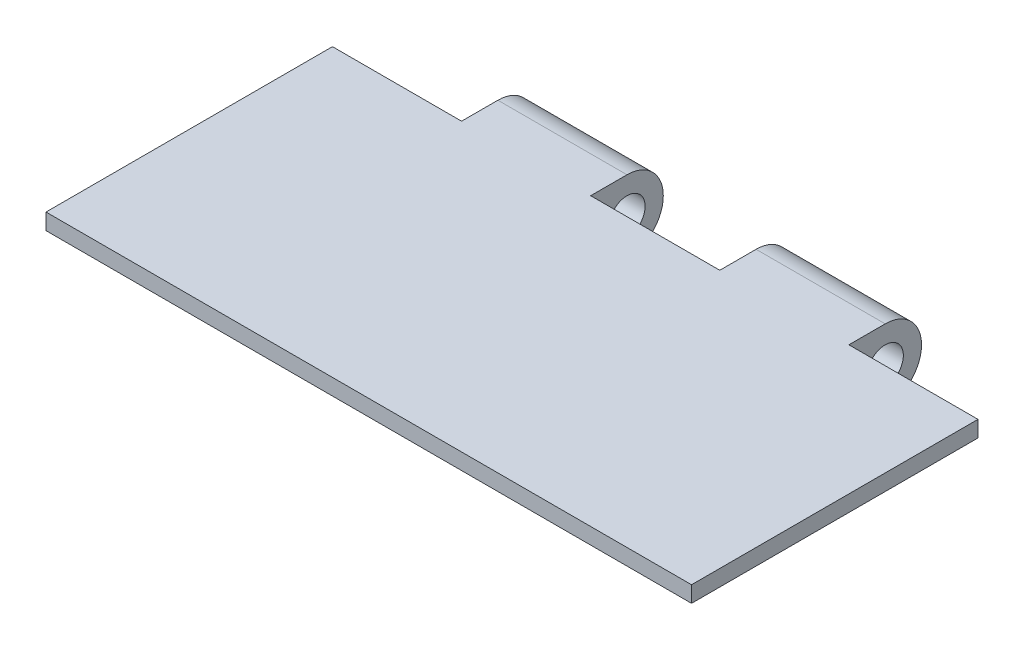
ISO-10303-21;
HEADER;
FILE_DESCRIPTION(('STEP AP214'),'2;1');
FILE_NAME('part.step','',(''),(''),'','','');
FILE_SCHEMA(('AUTOMOTIVE_DESIGN { 1 0 10303 214 1 1 1 1 }'));
ENDSEC;
DATA;
#1=APPLICATION_CONTEXT('core data for automotive mechanical design processes');
#2=APPLICATION_PROTOCOL_DEFINITION('international standard','automotive_design',2000,#1);
#3=PRODUCT_CONTEXT('',#1,'mechanical');
#4=PRODUCT('Part','Part','',(#3));
#5=PRODUCT_RELATED_PRODUCT_CATEGORY('part','',(#4));
#6=PRODUCT_DEFINITION_FORMATION('','',#4);
#7=PRODUCT_DEFINITION_CONTEXT('part definition',#1,'design');
#8=PRODUCT_DEFINITION('design','',#6,#7);
#9=PRODUCT_DEFINITION_SHAPE('','',#8);
#10=(LENGTH_UNIT() NAMED_UNIT(*) SI_UNIT(.MILLI.,.METRE.));
#11=(NAMED_UNIT(*) PLANE_ANGLE_UNIT() SI_UNIT($,.RADIAN.));
#12=(NAMED_UNIT(*) SI_UNIT($,.STERADIAN.) SOLID_ANGLE_UNIT());
#13=UNCERTAINTY_MEASURE_WITH_UNIT(LENGTH_MEASURE(1.E-05),#10,'distance_accuracy_value','');
#14=(GEOMETRIC_REPRESENTATION_CONTEXT(3) GLOBAL_UNCERTAINTY_ASSIGNED_CONTEXT((#13)) GLOBAL_UNIT_ASSIGNED_CONTEXT((#10,
#11,#12)) REPRESENTATION_CONTEXT('',''));
#15=CARTESIAN_POINT('',(0.,0.,0.));
#16=DIRECTION('',(0.,0.,1.));
#17=DIRECTION('',(1.,0.,0.));
#18=AXIS2_PLACEMENT_3D('',#15,#16,#17);
#19=CARTESIAN_POINT('',(2.68913183279742,0.635,-10.5257360713697));
#20=DIRECTION('',(1.,0.,0.));
#21=DIRECTION('',(0.,0.,-1.));
#22=AXIS2_PLACEMENT_3D('',#19,#20,#21);
#23=PLANE('',#22);
#24=DIRECTION('',(0.,0.,1.));
#25=VECTOR('',#24,1.);
#26=CARTESIAN_POINT('',(2.68913183279742,0.,-10.5257360713697));
#27=LINE('',#26,#25);
#28=CARTESIAN_POINT('',(2.68913183279742,0.,-10.5257360713697));
#29=VERTEX_POINT('',#28);
#30=CARTESIAN_POINT('',(2.68913183279743,0.,0.74551392863026));
#31=VERTEX_POINT('',#30);
#32=EDGE_CURVE('E276',#29,#31,#27,.T.);
#33=ORIENTED_EDGE('',*,*,#32,.T.);
#34=DIRECTION('',(0.,-1.,0.));
#35=VECTOR('',#34,1.);
#36=CARTESIAN_POINT('',(2.68913183279743,0.635,0.74551392863026));
#37=LINE('',#36,#35);
#38=CARTESIAN_POINT('',(2.68913183279743,0.635,0.74551392863026));
#39=VERTEX_POINT('',#38);
#40=EDGE_CURVE('E206',#39,#31,#37,.T.);
#41=ORIENTED_EDGE('',*,*,#40,.F.);
#42=DIRECTION('',(0.,0.,1.));
#43=VECTOR('',#42,1.);
#44=CARTESIAN_POINT('',(2.68913183279742,0.635,-10.5257360713697));
#45=LINE('',#44,#43);
#46=CARTESIAN_POINT('',(2.68913183279742,0.635,-10.5257360713697));
#47=VERTEX_POINT('',#46);
#48=EDGE_CURVE('E286',#47,#39,#45,.T.);
#49=ORIENTED_EDGE('',*,*,#48,.F.);
#50=DIRECTION('',(0.,-1.,0.));
#51=VECTOR('',#50,1.);
#52=CARTESIAN_POINT('',(2.68913183279742,0.635,-10.5257360713697));
#53=LINE('',#52,#51);
#54=EDGE_CURVE('E275',#47,#29,#53,.T.);
#55=ORIENTED_EDGE('',*,*,#54,.T.);
#56=EDGE_LOOP('',(#33,#41,#49,#55));
#57=FACE_BOUND('',#56,.T.);
#58=ADVANCED_FACE('F48',(#57),#23,.F.);
#59=CARTESIAN_POINT('',(28.0891318327974,0.635,0.745513928630257));
#60=DIRECTION('',(0.,0.,-1.));
#61=DIRECTION('',(-1.,0.,0.));
#62=AXIS2_PLACEMENT_3D('',#59,#60,#61);
#63=PLANE('',#62);
#64=DIRECTION('',(1.,0.,0.));
#65=VECTOR('',#64,1.);
#66=CARTESIAN_POINT('',(28.0891318327974,0.,0.745513928630257));
#67=LINE('',#66,#65);
#68=CARTESIAN_POINT('',(28.0891318327974,0.,0.745513928630257));
#69=VERTEX_POINT('',#68);
#70=EDGE_CURVE('E279',#31,#69,#67,.T.);
#71=ORIENTED_EDGE('',*,*,#70,.T.);
#72=DIRECTION('',(0.,-1.,0.));
#73=VECTOR('',#72,1.);
#74=CARTESIAN_POINT('',(28.0891318327974,0.635,0.745513928630257));
#75=LINE('',#74,#73);
#76=CARTESIAN_POINT('',(28.0891318327974,0.635,0.745513928630257));
#77=VERTEX_POINT('',#76);
#78=EDGE_CURVE('E297',#77,#69,#75,.T.);
#79=ORIENTED_EDGE('',*,*,#78,.F.);
#80=DIRECTION('',(1.,0.,0.));
#81=VECTOR('',#80,1.);
#82=CARTESIAN_POINT('',(28.0891318327974,0.635,0.745513928630257));
#83=LINE('',#82,#81);
#84=EDGE_CURVE('E304',#39,#77,#83,.T.);
#85=ORIENTED_EDGE('',*,*,#84,.F.);
#86=ORIENTED_EDGE('',*,*,#40,.T.);
#87=EDGE_LOOP('',(#71,#79,#85,#86));
#88=FACE_BOUND('',#87,.T.);
#89=ADVANCED_FACE('F302',(#88),#63,.F.);
#90=CARTESIAN_POINT('',(28.0891318327974,0.635,-10.5257360713697));
#91=DIRECTION('',(-1.,0.,0.));
#92=DIRECTION('',(0.,0.,1.));
#93=AXIS2_PLACEMENT_3D('',#90,#91,#92);
#94=PLANE('',#93);
#95=DIRECTION('',(0.,0.,-1.));
#96=VECTOR('',#95,1.);
#97=CARTESIAN_POINT('',(28.0891318327974,0.,-10.5257360713697));
#98=LINE('',#97,#96);
#99=CARTESIAN_POINT('',(28.0891318327974,0.,-10.5257360713697));
#100=VERTEX_POINT('',#99);
#101=EDGE_CURVE('E282',#69,#100,#98,.T.);
#102=ORIENTED_EDGE('',*,*,#101,.T.);
#103=DIRECTION('',(0.,-1.,0.));
#104=VECTOR('',#103,1.);
#105=CARTESIAN_POINT('',(28.0891318327974,0.635,-10.5257360713697));
#106=LINE('',#105,#104);
#107=CARTESIAN_POINT('',(28.0891318327974,0.635,-10.5257360713697));
#108=VERTEX_POINT('',#107);
#109=EDGE_CURVE('E294',#108,#100,#106,.T.);
#110=ORIENTED_EDGE('',*,*,#109,.F.);
#111=DIRECTION('',(0.,0.,-1.));
#112=VECTOR('',#111,1.);
#113=CARTESIAN_POINT('',(28.0891318327974,0.635,-10.5257360713697));
#114=LINE('',#113,#112);
#115=EDGE_CURVE('E264',#77,#108,#114,.T.);
#116=ORIENTED_EDGE('',*,*,#115,.F.);
#117=ORIENTED_EDGE('',*,*,#78,.T.);
#118=EDGE_LOOP('',(#102,#110,#116,#117));
#119=FACE_BOUND('',#118,.T.);
#120=ADVANCED_FACE('F313',(#119),#94,.F.);
#121=CARTESIAN_POINT('',(28.0891318327974,0.635,-10.5257360713697));
#122=DIRECTION('',(0.,0.,1.));
#123=DIRECTION('',(1.,0.,0.));
#124=AXIS2_PLACEMENT_3D('',#121,#122,#123);
#125=PLANE('',#124);
#126=DIRECTION('',(-1.,0.,0.));
#127=VECTOR('',#126,1.);
#128=CARTESIAN_POINT('',(28.0891318327974,0.,-10.5257360713697));
#129=LINE('',#128,#127);
#130=CARTESIAN_POINT('',(23.0091318327974,0.,-10.5257360713697));
#131=VERTEX_POINT('',#130);
#132=EDGE_CURVE('E192',#100,#131,#129,.T.);
#133=ORIENTED_EDGE('',*,*,#132,.T.);
#134=DIRECTION('',(0.,-1.,0.));
#135=VECTOR('',#134,1.);
#136=CARTESIAN_POINT('',(23.0091318327974,0.635,-10.5257360713697));
#137=LINE('',#136,#135);
#138=CARTESIAN_POINT('',(23.0091318327974,0.635,-10.5257360713697));
#139=VERTEX_POINT('',#138);
#140=EDGE_CURVE('E196',#139,#131,#137,.T.);
#141=ORIENTED_EDGE('',*,*,#140,.F.);
#142=DIRECTION('',(-1.,0.,0.));
#143=VECTOR('',#142,1.);
#144=CARTESIAN_POINT('',(28.0891318327974,0.635,-10.5257360713697));
#145=LINE('',#144,#143);
#146=EDGE_CURVE('E259',#108,#139,#145,.T.);
#147=ORIENTED_EDGE('',*,*,#146,.F.);
#148=ORIENTED_EDGE('',*,*,#109,.T.);
#149=EDGE_LOOP('',(#133,#141,#147,#148));
#150=FACE_BOUND('',#149,.T.);
#151=ADVANCED_FACE('F316',(#150),#125,.F.);
#152=CARTESIAN_POINT('',(23.0091318327974,0.635,-13.3832360713697));
#153=DIRECTION('',(-1.,0.,0.));
#154=DIRECTION('',(0.,0.,1.));
#155=AXIS2_PLACEMENT_3D('',#152,#153,#154);
#156=PLANE('',#155);
#157=CARTESIAN_POINT('',(23.0091318327974,-0.79375,-11.9544860713697));
#158=DIRECTION('',(1.,0.,0.));
#159=DIRECTION('',(0.,0.,-1.));
#160=AXIS2_PLACEMENT_3D('',#157,#158,#159);
#161=CIRCLE('',#160,0.714374999999999);
#162=CARTESIAN_POINT('',(23.0091318327974,-0.79375,-12.6688610713697));
#163=VERTEX_POINT('',#162);
#164=EDGE_CURVE('E408',#163,#163,#161,.T.);
#165=ORIENTED_EDGE('',*,*,#164,.F.);
#166=EDGE_LOOP('',(#165));
#167=FACE_BOUND('',#166,.T.);
#168=DIRECTION('',(0.,1.,0.));
#169=VECTOR('',#168,1.);
#170=CARTESIAN_POINT('',(23.0091318327974,-2.2225,-10.5257360713697));
#171=LINE('',#170,#169);
#172=CARTESIAN_POINT('',(23.0091318327974,-0.79375,-10.5257360713697));
#173=VERTEX_POINT('',#172);
#174=EDGE_CURVE('E173',#173,#131,#171,.T.);
#175=ORIENTED_EDGE('',*,*,#174,.F.);
#176=CARTESIAN_POINT('',(23.0091318327974,-0.79375,-11.9544860713697));
#177=DIRECTION('',(-1.,0.,0.));
#178=DIRECTION('',(0.,0.,1.));
#179=AXIS2_PLACEMENT_3D('',#176,#177,#178);
#180=CIRCLE('',#179,1.42875);
#181=CARTESIAN_POINT('',(23.0091318327974,-2.2225,-11.9544860713697));
#182=VERTEX_POINT('',#181);
#183=EDGE_CURVE('E227',#173,#182,#180,.F.);
#184=ORIENTED_EDGE('',*,*,#183,.T.);
#185=CARTESIAN_POINT('',(23.0091318327974,-0.79375,-11.9544860713697));
#186=DIRECTION('',(-1.,0.,0.));
#187=DIRECTION('',(0.,0.,1.));
#188=AXIS2_PLACEMENT_3D('',#185,#186,#187);
#189=CIRCLE('',#188,1.42875);
#190=CARTESIAN_POINT('',(23.0091318327974,-0.79375,-13.3832360713697));
#191=VERTEX_POINT('',#190);
#192=EDGE_CURVE('E225',#182,#191,#189,.F.);
#193=ORIENTED_EDGE('',*,*,#192,.T.);
#194=CARTESIAN_POINT('',(23.0091318327974,-0.79375,-11.9544860713697));
#195=DIRECTION('',(-1.,0.,0.));
#196=DIRECTION('',(0.,0.,1.));
#197=AXIS2_PLACEMENT_3D('',#194,#195,#196);
#198=CIRCLE('',#197,1.42875);
#199=CARTESIAN_POINT('',(23.0091318327974,0.635,-11.9544860713697));
#200=VERTEX_POINT('',#199);
#201=EDGE_CURVE('E223',#191,#200,#198,.F.);
#202=ORIENTED_EDGE('',*,*,#201,.T.);
#203=DIRECTION('',(0.,0.,-1.));
#204=VECTOR('',#203,1.);
#205=CARTESIAN_POINT('',(23.0091318327974,0.635,-13.3832360713697));
#206=LINE('',#205,#204);
#207=EDGE_CURVE('E255',#139,#200,#206,.T.);
#208=ORIENTED_EDGE('',*,*,#207,.F.);
#209=ORIENTED_EDGE('',*,*,#140,.T.);
#210=EDGE_LOOP('',(#175,#184,#193,#202,#208,#209));
#211=FACE_BOUND('',#210,.T.);
#212=ADVANCED_FACE('F253',(#167,#211),#156,.F.);
#213=CARTESIAN_POINT('',(17.9291318327974,0.635,-13.3832360713697));
#214=DIRECTION('',(1.,0.,0.));
#215=DIRECTION('',(0.,0.,-1.));
#216=AXIS2_PLACEMENT_3D('',#213,#214,#215);
#217=PLANE('',#216);
#218=CARTESIAN_POINT('',(17.9291318327974,-0.79375,-11.9544860713697));
#219=DIRECTION('',(1.,0.,0.));
#220=DIRECTION('',(0.,0.,-1.));
#221=AXIS2_PLACEMENT_3D('',#218,#219,#220);
#222=CIRCLE('',#221,0.714374999999999);
#223=CARTESIAN_POINT('',(17.9291318327974,-0.79375,-12.6688610713697));
#224=VERTEX_POINT('',#223);
#225=EDGE_CURVE('E242',#224,#224,#222,.T.);
#226=ORIENTED_EDGE('',*,*,#225,.T.);
#227=EDGE_LOOP('',(#226));
#228=FACE_BOUND('',#227,.T.);
#229=CARTESIAN_POINT('',(17.9291318327974,-0.79375,-11.9544860713697));
#230=DIRECTION('',(1.,0.,0.));
#231=DIRECTION('',(0.,0.,-1.));
#232=AXIS2_PLACEMENT_3D('',#229,#230,#231);
#233=CIRCLE('',#232,1.42875);
#234=CARTESIAN_POINT('',(17.9291318327974,-0.79375,-13.3832360713697));
#235=VERTEX_POINT('',#234);
#236=CARTESIAN_POINT('',(17.9291318327974,-2.2225,-11.9544860713697));
#237=VERTEX_POINT('',#236);
#238=EDGE_CURVE('E72',#235,#237,#233,.F.);
#239=ORIENTED_EDGE('',*,*,#238,.T.);
#240=CARTESIAN_POINT('',(17.9291318327974,-0.79375,-11.9544860713697));
#241=DIRECTION('',(1.,0.,0.));
#242=DIRECTION('',(0.,0.,-1.));
#243=AXIS2_PLACEMENT_3D('',#240,#241,#242);
#244=CIRCLE('',#243,1.42875);
#245=CARTESIAN_POINT('',(17.9291318327974,-0.79375,-10.5257360713697));
#246=VERTEX_POINT('',#245);
#247=EDGE_CURVE('E168',#237,#246,#244,.F.);
#248=ORIENTED_EDGE('',*,*,#247,.T.);
#249=DIRECTION('',(0.,1.,0.));
#250=VECTOR('',#249,1.);
#251=CARTESIAN_POINT('',(17.9291318327974,-2.2225,-10.5257360713697));
#252=LINE('',#251,#250);
#253=CARTESIAN_POINT('',(17.9291318327974,0.,-10.5257360713697));
#254=VERTEX_POINT('',#253);
#255=EDGE_CURVE('E161',#246,#254,#252,.T.);
#256=ORIENTED_EDGE('',*,*,#255,.T.);
#257=DIRECTION('',(0.,-1.,0.));
#258=VECTOR('',#257,1.);
#259=CARTESIAN_POINT('',(17.9291318327974,0.635,-10.5257360713697));
#260=LINE('',#259,#258);
#261=CARTESIAN_POINT('',(17.9291318327974,0.635,-10.5257360713697));
#262=VERTEX_POINT('',#261);
#263=EDGE_CURVE('E165',#262,#254,#260,.T.);
#264=ORIENTED_EDGE('',*,*,#263,.F.);
#265=DIRECTION('',(0.,0.,1.));
#266=VECTOR('',#265,1.);
#267=CARTESIAN_POINT('',(17.9291318327974,0.635,-13.3832360713697));
#268=LINE('',#267,#266);
#269=CARTESIAN_POINT('',(17.9291318327974,0.635,-11.9544860713697));
#270=VERTEX_POINT('',#269);
#271=EDGE_CURVE('E261',#270,#262,#268,.T.);
#272=ORIENTED_EDGE('',*,*,#271,.F.);
#273=CARTESIAN_POINT('',(17.9291318327974,-0.79375,-11.9544860713697));
#274=DIRECTION('',(1.,0.,0.));
#275=DIRECTION('',(0.,0.,-1.));
#276=AXIS2_PLACEMENT_3D('',#273,#274,#275);
#277=CIRCLE('',#276,1.42875);
#278=EDGE_CURVE('E229',#270,#235,#277,.F.);
#279=ORIENTED_EDGE('',*,*,#278,.T.);
#280=EDGE_LOOP('',(#239,#248,#256,#264,#272,#279));
#281=FACE_BOUND('',#280,.T.);
#282=ADVANCED_FACE('F163',(#228,#281),#217,.F.);
#283=CARTESIAN_POINT('',(12.8491318327974,0.635,-10.5257360713697));
#284=DIRECTION('',(0.,0.,1.));
#285=DIRECTION('',(1.,0.,0.));
#286=AXIS2_PLACEMENT_3D('',#283,#284,#285);
#287=PLANE('',#286);
#288=DIRECTION('',(-1.,0.,0.));
#289=VECTOR('',#288,1.);
#290=CARTESIAN_POINT('',(12.8491318327974,0.,-10.5257360713697));
#291=LINE('',#290,#289);
#292=CARTESIAN_POINT('',(12.8491318327974,0.,-10.5257360713697));
#293=VERTEX_POINT('',#292);
#294=EDGE_CURVE('E180',#254,#293,#291,.T.);
#295=ORIENTED_EDGE('',*,*,#294,.T.);
#296=DIRECTION('',(0.,-1.,0.));
#297=VECTOR('',#296,1.);
#298=CARTESIAN_POINT('',(12.8491318327974,0.635,-10.5257360713697));
#299=LINE('',#298,#297);
#300=CARTESIAN_POINT('',(12.8491318327974,0.635,-10.5257360713697));
#301=VERTEX_POINT('',#300);
#302=EDGE_CURVE('E197',#301,#293,#299,.T.);
#303=ORIENTED_EDGE('',*,*,#302,.F.);
#304=DIRECTION('',(-1.,0.,0.));
#305=VECTOR('',#304,1.);
#306=CARTESIAN_POINT('',(12.8491318327974,0.635,-10.5257360713697));
#307=LINE('',#306,#305);
#308=EDGE_CURVE('E195',#262,#301,#307,.T.);
#309=ORIENTED_EDGE('',*,*,#308,.F.);
#310=ORIENTED_EDGE('',*,*,#263,.T.);
#311=EDGE_LOOP('',(#295,#303,#309,#310));
#312=FACE_BOUND('',#311,.T.);
#313=ADVANCED_FACE('F194',(#312),#287,.F.);
#314=CARTESIAN_POINT('',(12.8491318327974,0.635,-13.3832360713697));
#315=DIRECTION('',(-1.,0.,0.));
#316=DIRECTION('',(0.,0.,1.));
#317=AXIS2_PLACEMENT_3D('',#314,#315,#316);
#318=PLANE('',#317);
#319=CARTESIAN_POINT('',(12.8491318327974,-0.79375,-11.9544860713697));
#320=DIRECTION('',(-1.,0.,0.));
#321=DIRECTION('',(0.,0.,1.));
#322=AXIS2_PLACEMENT_3D('',#319,#320,#321);
#323=CIRCLE('',#322,0.714374999999999);
#324=CARTESIAN_POINT('',(12.8491318327974,-0.79375,-11.2401110713697));
#325=VERTEX_POINT('',#324);
#326=EDGE_CURVE('E411',#325,#325,#323,.T.);
#327=ORIENTED_EDGE('',*,*,#326,.T.);
#328=EDGE_LOOP('',(#327));
#329=FACE_BOUND('',#328,.T.);
#330=DIRECTION('',(0.,1.,0.));
#331=VECTOR('',#330,1.);
#332=CARTESIAN_POINT('',(12.8491318327974,-2.2225,-10.5257360713697));
#333=LINE('',#332,#331);
#334=CARTESIAN_POINT('',(12.8491318327974,-0.79375,-10.5257360713697));
#335=VERTEX_POINT('',#334);
#336=EDGE_CURVE('E280',#335,#293,#333,.T.);
#337=ORIENTED_EDGE('',*,*,#336,.F.);
#338=CARTESIAN_POINT('',(12.8491318327974,-0.79375,-11.9544860713697));
#339=DIRECTION('',(-1.,0.,0.));
#340=DIRECTION('',(0.,0.,1.));
#341=AXIS2_PLACEMENT_3D('',#338,#339,#340);
#342=CIRCLE('',#341,1.42875);
#343=CARTESIAN_POINT('',(12.8491318327974,-2.2225,-11.9544860713697));
#344=VERTEX_POINT('',#343);
#345=EDGE_CURVE('E213',#335,#344,#342,.F.);
#346=ORIENTED_EDGE('',*,*,#345,.T.);
#347=CARTESIAN_POINT('',(12.8491318327974,-0.79375,-11.9544860713697));
#348=DIRECTION('',(-1.,0.,0.));
#349=DIRECTION('',(0.,0.,1.));
#350=AXIS2_PLACEMENT_3D('',#347,#348,#349);
#351=CIRCLE('',#350,1.42875);
#352=CARTESIAN_POINT('',(12.8491318327974,-0.79375,-13.3832360713697));
#353=VERTEX_POINT('',#352);
#354=EDGE_CURVE('E211',#344,#353,#351,.F.);
#355=ORIENTED_EDGE('',*,*,#354,.T.);
#356=CARTESIAN_POINT('',(12.8491318327974,-0.79375,-11.9544860713697));
#357=DIRECTION('',(-1.,0.,0.));
#358=DIRECTION('',(0.,0.,1.));
#359=AXIS2_PLACEMENT_3D('',#356,#357,#358);
#360=CIRCLE('',#359,1.42875);
#361=CARTESIAN_POINT('',(12.8491318327974,0.635,-11.9544860713697));
#362=VERTEX_POINT('',#361);
#363=EDGE_CURVE('E204',#353,#362,#360,.F.);
#364=ORIENTED_EDGE('',*,*,#363,.T.);
#365=DIRECTION('',(0.,0.,-1.));
#366=VECTOR('',#365,1.);
#367=CARTESIAN_POINT('',(12.8491318327974,0.635,-13.3832360713697));
#368=LINE('',#367,#366);
#369=EDGE_CURVE('E269',#301,#362,#368,.T.);
#370=ORIENTED_EDGE('',*,*,#369,.F.);
#371=ORIENTED_EDGE('',*,*,#302,.T.);
#372=EDGE_LOOP('',(#337,#346,#355,#364,#370,#371));
#373=FACE_BOUND('',#372,.T.);
#374=ADVANCED_FACE('F340',(#329,#373),#318,.F.);
#375=CARTESIAN_POINT('',(7.76913183279742,0.635,-13.3832360713697));
#376=DIRECTION('',(1.,0.,0.));
#377=DIRECTION('',(0.,0.,-1.));
#378=AXIS2_PLACEMENT_3D('',#375,#376,#377);
#379=PLANE('',#378);
#380=CARTESIAN_POINT('',(7.76913183279742,-0.79375,-11.9544860713697));
#381=DIRECTION('',(1.,0.,0.));
#382=DIRECTION('',(0.,0.,-1.));
#383=AXIS2_PLACEMENT_3D('',#380,#381,#382);
#384=CIRCLE('',#383,0.714374999999999);
#385=CARTESIAN_POINT('',(7.76913183279742,-0.79375,-12.6688610713697));
#386=VERTEX_POINT('',#385);
#387=EDGE_CURVE('E52',#386,#386,#384,.T.);
#388=ORIENTED_EDGE('',*,*,#387,.T.);
#389=EDGE_LOOP('',(#388));
#390=FACE_BOUND('',#389,.T.);
#391=CARTESIAN_POINT('',(7.76913183279742,-0.79375,-11.9544860713697));
#392=DIRECTION('',(1.,0.,0.));
#393=DIRECTION('',(0.,0.,-1.));
#394=AXIS2_PLACEMENT_3D('',#391,#392,#393);
#395=CIRCLE('',#394,1.42875);
#396=CARTESIAN_POINT('',(7.76913183279742,-0.79375,-13.3832360713697));
#397=VERTEX_POINT('',#396);
#398=CARTESIAN_POINT('',(7.76913183279742,-2.2225,-11.9544860713697));
#399=VERTEX_POINT('',#398);
#400=EDGE_CURVE('E217',#397,#399,#395,.F.);
#401=ORIENTED_EDGE('',*,*,#400,.T.);
#402=CARTESIAN_POINT('',(7.76913183279742,-0.79375,-11.9544860713697));
#403=DIRECTION('',(1.,0.,0.));
#404=DIRECTION('',(0.,0.,-1.));
#405=AXIS2_PLACEMENT_3D('',#402,#403,#404);
#406=CIRCLE('',#405,1.42875);
#407=CARTESIAN_POINT('',(7.76913183279742,-0.79375,-10.5257360713697));
#408=VERTEX_POINT('',#407);
#409=EDGE_CURVE('E219',#399,#408,#406,.F.);
#410=ORIENTED_EDGE('',*,*,#409,.T.);
#411=DIRECTION('',(0.,1.,0.));
#412=VECTOR('',#411,1.);
#413=CARTESIAN_POINT('',(7.76913183279742,-2.2225,-10.5257360713697));
#414=LINE('',#413,#412);
#415=CARTESIAN_POINT('',(7.76913183279742,0.,-10.5257360713697));
#416=VERTEX_POINT('',#415);
#417=EDGE_CURVE('E317',#408,#416,#414,.T.);
#418=ORIENTED_EDGE('',*,*,#417,.T.);
#419=DIRECTION('',(0.,-1.,0.));
#420=VECTOR('',#419,1.);
#421=CARTESIAN_POINT('',(7.76913183279742,0.635,-10.5257360713697));
#422=LINE('',#421,#420);
#423=CARTESIAN_POINT('',(7.76913183279742,0.635,-10.5257360713697));
#424=VERTEX_POINT('',#423);
#425=EDGE_CURVE('E289',#424,#416,#422,.T.);
#426=ORIENTED_EDGE('',*,*,#425,.F.);
#427=DIRECTION('',(0.,0.,1.));
#428=VECTOR('',#427,1.);
#429=CARTESIAN_POINT('',(7.76913183279742,0.635,-13.3832360713697));
#430=LINE('',#429,#428);
#431=CARTESIAN_POINT('',(7.76913183279742,0.635,-11.9544860713697));
#432=VERTEX_POINT('',#431);
#433=EDGE_CURVE('E271',#432,#424,#430,.T.);
#434=ORIENTED_EDGE('',*,*,#433,.F.);
#435=CARTESIAN_POINT('',(7.76913183279742,-0.79375,-11.9544860713697));
#436=DIRECTION('',(1.,0.,0.));
#437=DIRECTION('',(0.,0.,-1.));
#438=AXIS2_PLACEMENT_3D('',#435,#436,#437);
#439=CIRCLE('',#438,1.42875);
#440=EDGE_CURVE('E215',#432,#397,#439,.F.);
#441=ORIENTED_EDGE('',*,*,#440,.T.);
#442=EDGE_LOOP('',(#401,#410,#418,#426,#434,#441));
#443=FACE_BOUND('',#442,.T.);
#444=ADVANCED_FACE('F331',(#390,#443),#379,.F.);
#445=CARTESIAN_POINT('',(2.68913183279742,0.635,-10.5257360713697));
#446=DIRECTION('',(0.,0.,1.));
#447=DIRECTION('',(1.,0.,0.));
#448=AXIS2_PLACEMENT_3D('',#445,#446,#447);
#449=PLANE('',#448);
#450=DIRECTION('',(-1.,0.,0.));
#451=VECTOR('',#450,1.);
#452=CARTESIAN_POINT('',(2.68913183279742,0.,-10.5257360713697));
#453=LINE('',#452,#451);
#454=EDGE_CURVE('E191',#416,#29,#453,.T.);
#455=ORIENTED_EDGE('',*,*,#454,.T.);
#456=ORIENTED_EDGE('',*,*,#54,.F.);
#457=DIRECTION('',(-1.,0.,0.));
#458=VECTOR('',#457,1.);
#459=CARTESIAN_POINT('',(2.68913183279742,0.635,-10.5257360713697));
#460=LINE('',#459,#458);
#461=EDGE_CURVE('E273',#424,#47,#460,.T.);
#462=ORIENTED_EDGE('',*,*,#461,.F.);
#463=ORIENTED_EDGE('',*,*,#425,.T.);
#464=EDGE_LOOP('',(#455,#456,#462,#463));
#465=FACE_BOUND('',#464,.T.);
#466=ADVANCED_FACE('F329',(#465),#449,.F.);
#467=CARTESIAN_POINT('',(0.,0.635,0.));
#468=DIRECTION('',(0.,-1.,0.));
#469=DIRECTION('',(0.,0.,-1.));
#470=AXIS2_PLACEMENT_3D('',#467,#468,#469);
#471=PLANE('',#470);
#472=ORIENTED_EDGE('',*,*,#369,.T.);
#473=DIRECTION('',(-1.,0.,0.));
#474=VECTOR('',#473,1.);
#475=CARTESIAN_POINT('',(0.,0.635,-11.9544860713697));
#476=LINE('',#475,#474);
#477=EDGE_CURVE('E13',#362,#432,#476,.T.);
#478=ORIENTED_EDGE('',*,*,#477,.T.);
#479=ORIENTED_EDGE('',*,*,#433,.T.);
#480=ORIENTED_EDGE('',*,*,#461,.T.);
#481=ORIENTED_EDGE('',*,*,#48,.T.);
#482=ORIENTED_EDGE('',*,*,#84,.T.);
#483=ORIENTED_EDGE('',*,*,#115,.T.);
#484=ORIENTED_EDGE('',*,*,#146,.T.);
#485=ORIENTED_EDGE('',*,*,#207,.T.);
#486=DIRECTION('',(-1.,0.,0.));
#487=VECTOR('',#486,1.);
#488=CARTESIAN_POINT('',(0.,0.635,-11.9544860713697));
#489=LINE('',#488,#487);
#490=EDGE_CURVE('E57',#200,#270,#489,.T.);
#491=ORIENTED_EDGE('',*,*,#490,.T.);
#492=ORIENTED_EDGE('',*,*,#271,.T.);
#493=ORIENTED_EDGE('',*,*,#308,.T.);
#494=EDGE_LOOP('',(#472,#478,#479,#480,#481,#482,#483,#484,#485,#491,#492,#493));
#495=FACE_BOUND('',#494,.T.);
#496=ADVANCED_FACE('F257',(#495),#471,.F.);
#497=CARTESIAN_POINT('',(0.,0.,0.));
#498=DIRECTION('',(0.,-1.,0.));
#499=DIRECTION('',(0.,0.,-1.));
#500=AXIS2_PLACEMENT_3D('',#497,#498,#499);
#501=PLANE('',#500);
#502=DIRECTION('',(-1.,0.,0.));
#503=VECTOR('',#502,1.);
#504=CARTESIAN_POINT('',(0.,0.,-10.5257360713697));
#505=LINE('',#504,#503);
#506=EDGE_CURVE('E183',#131,#254,#505,.T.);
#507=ORIENTED_EDGE('',*,*,#506,.F.);
#508=ORIENTED_EDGE('',*,*,#132,.F.);
#509=ORIENTED_EDGE('',*,*,#101,.F.);
#510=ORIENTED_EDGE('',*,*,#70,.F.);
#511=ORIENTED_EDGE('',*,*,#32,.F.);
#512=ORIENTED_EDGE('',*,*,#454,.F.);
#513=DIRECTION('',(-1.,0.,0.));
#514=VECTOR('',#513,1.);
#515=CARTESIAN_POINT('',(0.,0.,-10.5257360713697));
#516=LINE('',#515,#514);
#517=EDGE_CURVE('E187',#293,#416,#516,.T.);
#518=ORIENTED_EDGE('',*,*,#517,.F.);
#519=ORIENTED_EDGE('',*,*,#294,.F.);
#520=EDGE_LOOP('',(#507,#508,#509,#510,#511,#512,#518,#519));
#521=FACE_BOUND('',#520,.T.);
#522=ADVANCED_FACE('F181',(#521),#501,.T.);
#523=CARTESIAN_POINT('',(12.8491318327974,-2.2225,-10.5257360713697));
#524=DIRECTION('',(0.,0.,1.));
#525=DIRECTION('',(1.,0.,0.));
#526=AXIS2_PLACEMENT_3D('',#523,#524,#525);
#527=PLANE('',#526);
#528=ORIENTED_EDGE('',*,*,#417,.F.);
#529=DIRECTION('',(1.,0.,0.));
#530=VECTOR('',#529,1.);
#531=CARTESIAN_POINT('',(12.8491318327974,-0.79375,-10.5257360713697));
#532=LINE('',#531,#530);
#533=EDGE_CURVE('E201',#408,#335,#532,.T.);
#534=ORIENTED_EDGE('',*,*,#533,.T.);
#535=ORIENTED_EDGE('',*,*,#336,.T.);
#536=ORIENTED_EDGE('',*,*,#517,.T.);
#537=EDGE_LOOP('',(#528,#534,#535,#536));
#538=FACE_BOUND('',#537,.T.);
#539=ADVANCED_FACE('F337',(#538),#527,.T.);
#540=CARTESIAN_POINT('',(17.9291318327974,-2.2225,-10.5257360713697));
#541=DIRECTION('',(0.,0.,1.));
#542=DIRECTION('',(1.,0.,0.));
#543=AXIS2_PLACEMENT_3D('',#540,#541,#542);
#544=PLANE('',#543);
#545=ORIENTED_EDGE('',*,*,#255,.F.);
#546=DIRECTION('',(1.,0.,0.));
#547=VECTOR('',#546,1.);
#548=CARTESIAN_POINT('',(23.0091318327974,-0.79375,-10.5257360713697));
#549=LINE('',#548,#547);
#550=EDGE_CURVE('E221',#246,#173,#549,.T.);
#551=ORIENTED_EDGE('',*,*,#550,.T.);
#552=ORIENTED_EDGE('',*,*,#174,.T.);
#553=ORIENTED_EDGE('',*,*,#506,.T.);
#554=EDGE_LOOP('',(#545,#551,#552,#553));
#555=FACE_BOUND('',#554,.T.);
#556=ADVANCED_FACE('F199',(#555),#544,.T.);
#557=CARTESIAN_POINT('',(0.,-0.79375,-11.9544860713697));
#558=DIRECTION('',(-1.,0.,0.));
#559=DIRECTION('',(0.,0.,1.));
#560=AXIS2_PLACEMENT_3D('',#557,#558,#559);
#561=CYLINDRICAL_SURFACE('',#560,1.42875);
#562=ORIENTED_EDGE('',*,*,#477,.F.);
#563=ORIENTED_EDGE('',*,*,#363,.F.);
#564=DIRECTION('',(-1.,0.,0.));
#565=VECTOR('',#564,1.);
#566=CARTESIAN_POINT('',(12.8491318327974,-0.79375,-13.3832360713697));
#567=LINE('',#566,#565);
#568=EDGE_CURVE('E174',#397,#353,#567,.F.);
#569=ORIENTED_EDGE('',*,*,#568,.F.);
#570=ORIENTED_EDGE('',*,*,#440,.F.);
#571=EDGE_LOOP('',(#562,#563,#569,#570));
#572=FACE_BOUND('',#571,.T.);
#573=ADVANCED_FACE('F346',(#572),#561,.T.);
#574=CARTESIAN_POINT('',(12.8491318327974,-0.79375,-11.9544860713697));
#575=DIRECTION('',(1.,0.,0.));
#576=DIRECTION('',(0.,0.,-1.));
#577=AXIS2_PLACEMENT_3D('',#574,#575,#576);
#578=CYLINDRICAL_SURFACE('',#577,1.42875);
#579=DIRECTION('',(-1.,0.,0.));
#580=VECTOR('',#579,1.);
#581=CARTESIAN_POINT('',(12.8491318327974,-2.2225,-11.9544860713697));
#582=LINE('',#581,#580);
#583=EDGE_CURVE('E234',#399,#344,#582,.F.);
#584=ORIENTED_EDGE('',*,*,#583,.F.);
#585=ORIENTED_EDGE('',*,*,#400,.F.);
#586=ORIENTED_EDGE('',*,*,#568,.T.);
#587=ORIENTED_EDGE('',*,*,#354,.F.);
#588=EDGE_LOOP('',(#584,#585,#586,#587));
#589=FACE_BOUND('',#588,.T.);
#590=ADVANCED_FACE('F351',(#589),#578,.T.);
#591=CARTESIAN_POINT('',(12.8491318327974,-0.79375,-11.9544860713697));
#592=DIRECTION('',(1.,0.,0.));
#593=DIRECTION('',(0.,0.,-1.));
#594=AXIS2_PLACEMENT_3D('',#591,#592,#593);
#595=CYLINDRICAL_SURFACE('',#594,1.42875);
#596=ORIENTED_EDGE('',*,*,#409,.F.);
#597=ORIENTED_EDGE('',*,*,#583,.T.);
#598=ORIENTED_EDGE('',*,*,#345,.F.);
#599=ORIENTED_EDGE('',*,*,#533,.F.);
#600=EDGE_LOOP('',(#596,#597,#598,#599));
#601=FACE_BOUND('',#600,.T.);
#602=ADVANCED_FACE('F353',(#601),#595,.T.);
#603=CARTESIAN_POINT('',(0.,-0.79375,-11.9544860713697));
#604=DIRECTION('',(-1.,0.,0.));
#605=DIRECTION('',(0.,0.,1.));
#606=AXIS2_PLACEMENT_3D('',#603,#604,#605);
#607=CYLINDRICAL_SURFACE('',#606,1.42875);
#608=ORIENTED_EDGE('',*,*,#490,.F.);
#609=ORIENTED_EDGE('',*,*,#201,.F.);
#610=DIRECTION('',(-1.,0.,0.));
#611=VECTOR('',#610,1.);
#612=CARTESIAN_POINT('',(23.0091318327974,-0.79375,-13.3832360713697));
#613=LINE('',#612,#611);
#614=EDGE_CURVE('E237',#235,#191,#613,.F.);
#615=ORIENTED_EDGE('',*,*,#614,.F.);
#616=ORIENTED_EDGE('',*,*,#278,.F.);
#617=EDGE_LOOP('',(#608,#609,#615,#616));
#618=FACE_BOUND('',#617,.T.);
#619=ADVANCED_FACE('F50',(#618),#607,.T.);
#620=CARTESIAN_POINT('',(23.0091318327974,-0.79375,-11.9544860713697));
#621=DIRECTION('',(-1.,0.,0.));
#622=DIRECTION('',(0.,0.,1.));
#623=AXIS2_PLACEMENT_3D('',#620,#621,#622);
#624=CYLINDRICAL_SURFACE('',#623,1.42875);
#625=DIRECTION('',(-1.,0.,0.));
#626=VECTOR('',#625,1.);
#627=CARTESIAN_POINT('',(0.,-2.2225,-11.9544860713697));
#628=LINE('',#627,#626);
#629=EDGE_CURVE('E240',#237,#182,#628,.F.);
#630=ORIENTED_EDGE('',*,*,#629,.F.);
#631=ORIENTED_EDGE('',*,*,#238,.F.);
#632=ORIENTED_EDGE('',*,*,#614,.T.);
#633=ORIENTED_EDGE('',*,*,#192,.F.);
#634=EDGE_LOOP('',(#630,#631,#632,#633));
#635=FACE_BOUND('',#634,.T.);
#636=ADVANCED_FACE('F247',(#635),#624,.T.);
#637=CARTESIAN_POINT('',(17.9291318327974,-0.79375,-11.9544860713697));
#638=DIRECTION('',(-1.,0.,0.));
#639=DIRECTION('',(0.,0.,1.));
#640=AXIS2_PLACEMENT_3D('',#637,#638,#639);
#641=CYLINDRICAL_SURFACE('',#640,1.42875);
#642=ORIENTED_EDGE('',*,*,#247,.F.);
#643=ORIENTED_EDGE('',*,*,#629,.T.);
#644=ORIENTED_EDGE('',*,*,#183,.F.);
#645=ORIENTED_EDGE('',*,*,#550,.F.);
#646=EDGE_LOOP('',(#642,#643,#644,#645));
#647=FACE_BOUND('',#646,.T.);
#648=ADVANCED_FACE('F403',(#647),#641,.T.);
#649=CARTESIAN_POINT('',(-6.99086816720258,-0.79375,-11.9544860713697));
#650=DIRECTION('',(1.,0.,0.));
#651=DIRECTION('',(0.,0.,-1.));
#652=AXIS2_PLACEMENT_3D('',#649,#650,#651);
#653=CYLINDRICAL_SURFACE('',#652,0.714374999999999);
#654=ORIENTED_EDGE('',*,*,#387,.F.);
#655=EDGE_LOOP('',(#654));
#656=FACE_BOUND('',#655,.T.);
#657=ORIENTED_EDGE('',*,*,#326,.F.);
#658=EDGE_LOOP('',(#657));
#659=FACE_BOUND('',#658,.T.);
#660=ADVANCED_FACE('F398',(#656,#659),#653,.F.);
#661=ORIENTED_EDGE('',*,*,#164,.T.);
#662=EDGE_LOOP('',(#661));
#663=FACE_BOUND('',#662,.T.);
#664=ORIENTED_EDGE('',*,*,#225,.F.);
#665=EDGE_LOOP('',(#664));
#666=FACE_BOUND('',#665,.T.);
#667=ADVANCED_FACE('F396',(#663,#666),#653,.F.);
#668=CLOSED_SHELL('',(#58,#89,#120,#151,#212,#282,#313,#374,#444,#466,#496,#522,#539,#556,#573,
#590,#602,#619,#636,#648,#660,#667));
#669=MANIFOLD_SOLID_BREP('B2',#668);
#670=ADVANCED_BREP_SHAPE_REPRESENTATION('',(#18,#669),#14);
#671=SHAPE_DEFINITION_REPRESENTATION(#9,#670);
ENDSEC;
END-ISO-10303-21;
